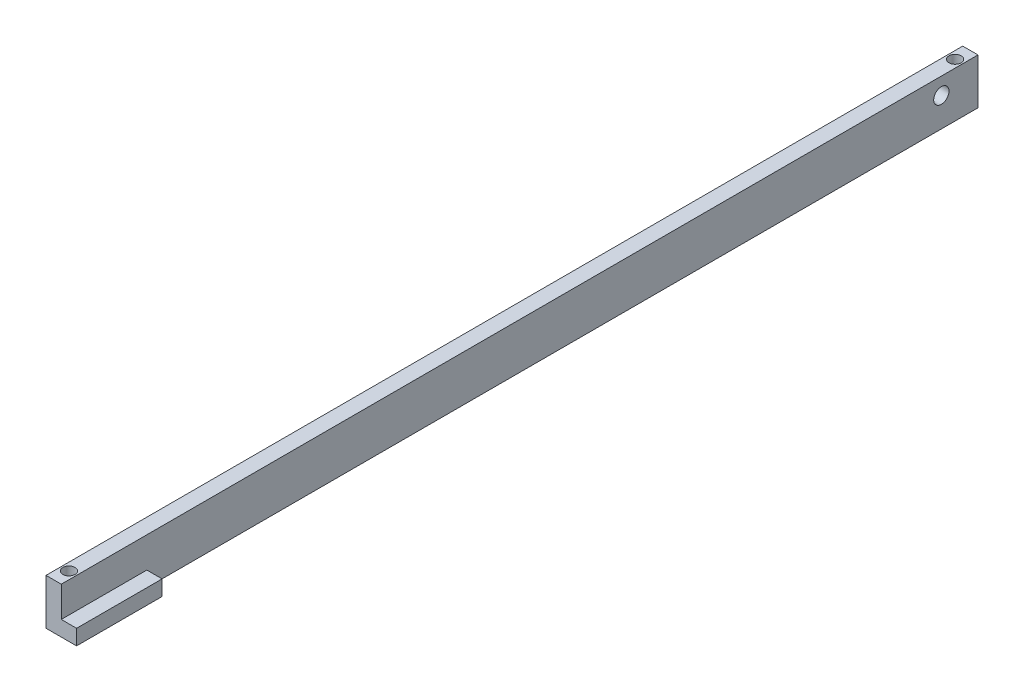
ISO-10303-21;
HEADER;
FILE_DESCRIPTION(('STEP AP214'),'2;1');
FILE_NAME('part.step','',(''),(''),'','','');
FILE_SCHEMA(('AUTOMOTIVE_DESIGN { 1 0 10303 214 1 1 1 1 }'));
ENDSEC;
DATA;
#1=APPLICATION_CONTEXT('core data for automotive mechanical design processes');
#2=APPLICATION_PROTOCOL_DEFINITION('international standard','automotive_design',2000,#1);
#3=PRODUCT_CONTEXT('',#1,'mechanical');
#4=PRODUCT('Part','Part','',(#3));
#5=PRODUCT_RELATED_PRODUCT_CATEGORY('part','',(#4));
#6=PRODUCT_DEFINITION_FORMATION('','',#4);
#7=PRODUCT_DEFINITION_CONTEXT('part definition',#1,'design');
#8=PRODUCT_DEFINITION('design','',#6,#7);
#9=PRODUCT_DEFINITION_SHAPE('','',#8);
#10=(LENGTH_UNIT() NAMED_UNIT(*) SI_UNIT(.MILLI.,.METRE.));
#11=(NAMED_UNIT(*) PLANE_ANGLE_UNIT() SI_UNIT($,.RADIAN.));
#12=(NAMED_UNIT(*) SI_UNIT($,.STERADIAN.) SOLID_ANGLE_UNIT());
#13=UNCERTAINTY_MEASURE_WITH_UNIT(LENGTH_MEASURE(1.E-05),#10,'distance_accuracy_value','');
#14=(GEOMETRIC_REPRESENTATION_CONTEXT(3) GLOBAL_UNCERTAINTY_ASSIGNED_CONTEXT((#13)) GLOBAL_UNIT_ASSIGNED_CONTEXT((#10,
#11,#12)) REPRESENTATION_CONTEXT('',''));
#15=CARTESIAN_POINT('',(0.,0.,0.));
#16=DIRECTION('',(0.,0.,1.));
#17=DIRECTION('',(1.,0.,0.));
#18=AXIS2_PLACEMENT_3D('',#15,#16,#17);
#19=CARTESIAN_POINT('',(0.,6.35,-381.));
#20=DIRECTION('',(1.,0.,0.));
#21=DIRECTION('',(0.,0.,-1.));
#22=AXIS2_PLACEMENT_3D('',#19,#20,#21);
#23=PLANE('',#22);
#24=DIRECTION('',(0.,-1.,0.));
#25=VECTOR('',#24,1.);
#26=CARTESIAN_POINT('',(0.,6.35,-35.56));
#27=LINE('',#26,#25);
#28=CARTESIAN_POINT('',(0.,6.35,-35.56));
#29=VERTEX_POINT('',#28);
#30=CARTESIAN_POINT('',(0.,0.,-35.56));
#31=VERTEX_POINT('',#30);
#32=EDGE_CURVE('E128',#29,#31,#27,.T.);
#33=ORIENTED_EDGE('',*,*,#32,.F.);
#34=DIRECTION('',(0.,0.,1.));
#35=VECTOR('',#34,1.);
#36=CARTESIAN_POINT('',(0.,6.35,-381.));
#37=LINE('',#36,#35);
#38=CARTESIAN_POINT('',(0.,6.35,0.));
#39=VERTEX_POINT('',#38);
#40=EDGE_CURVE('E45',#29,#39,#37,.T.);
#41=ORIENTED_EDGE('',*,*,#40,.T.);
#42=DIRECTION('',(0.,1.,0.));
#43=VECTOR('',#42,1.);
#44=CARTESIAN_POINT('',(0.,6.35,0.));
#45=LINE('',#44,#43);
#46=CARTESIAN_POINT('',(0.,0.,0.));
#47=VERTEX_POINT('',#46);
#48=EDGE_CURVE('E162',#47,#39,#45,.T.);
#49=ORIENTED_EDGE('',*,*,#48,.F.);
#50=DIRECTION('',(0.,0.,1.));
#51=VECTOR('',#50,1.);
#52=CARTESIAN_POINT('',(0.,0.,-381.));
#53=LINE('',#52,#51);
#54=EDGE_CURVE('E11',#31,#47,#53,.T.);
#55=ORIENTED_EDGE('',*,*,#54,.F.);
#56=EDGE_LOOP('',(#33,#41,#49,#55));
#57=FACE_BOUND('',#56,.T.);
#58=ADVANCED_FACE('F42',(#57),#23,.T.);
#59=CARTESIAN_POINT('',(0.,0.,-381.));
#60=DIRECTION('',(0.,-1.,0.));
#61=DIRECTION('',(1.,0.,0.));
#62=AXIS2_PLACEMENT_3D('',#59,#60,#61);
#63=PLANE('',#62);
#64=DIRECTION('',(0.,0.,-1.));
#65=VECTOR('',#64,1.);
#66=CARTESIAN_POINT('',(-6.35,0.,-35.56));
#67=LINE('',#66,#65);
#68=CARTESIAN_POINT('',(-6.35,0.,-35.56));
#69=VERTEX_POINT('',#68);
#70=CARTESIAN_POINT('',(-6.35,0.,-381.));
#71=VERTEX_POINT('',#70);
#72=EDGE_CURVE('E206',#69,#71,#67,.T.);
#73=ORIENTED_EDGE('',*,*,#72,.F.);
#74=DIRECTION('',(-1.,0.,0.));
#75=VECTOR('',#74,1.);
#76=CARTESIAN_POINT('',(-6.35,0.,-35.56));
#77=LINE('',#76,#75);
#78=EDGE_CURVE('E115',#31,#69,#77,.T.);
#79=ORIENTED_EDGE('',*,*,#78,.F.);
#80=ORIENTED_EDGE('',*,*,#54,.T.);
#81=DIRECTION('',(1.,0.,0.));
#82=VECTOR('',#81,1.);
#83=CARTESIAN_POINT('',(0.,0.,0.));
#84=LINE('',#83,#82);
#85=CARTESIAN_POINT('',(-12.7,0.,0.));
#86=VERTEX_POINT('',#85);
#87=EDGE_CURVE('E145',#86,#47,#84,.T.);
#88=ORIENTED_EDGE('',*,*,#87,.F.);
#89=DIRECTION('',(0.,0.,1.));
#90=VECTOR('',#89,1.);
#91=CARTESIAN_POINT('',(-12.7,0.,-381.));
#92=LINE('',#91,#90);
#93=CARTESIAN_POINT('',(-12.7,0.,-381.));
#94=VERTEX_POINT('',#93);
#95=EDGE_CURVE('E51',#94,#86,#92,.T.);
#96=ORIENTED_EDGE('',*,*,#95,.F.);
#97=DIRECTION('',(1.,0.,0.));
#98=VECTOR('',#97,1.);
#99=CARTESIAN_POINT('',(0.,0.,-381.));
#100=LINE('',#99,#98);
#101=EDGE_CURVE('E139',#94,#71,#100,.T.);
#102=ORIENTED_EDGE('',*,*,#101,.T.);
#103=EDGE_LOOP('',(#73,#79,#80,#88,#96,#102));
#104=FACE_BOUND('',#103,.T.);
#105=CARTESIAN_POINT('',(-9.52499999999996,0.,-374.65));
#106=DIRECTION('',(0.,-1.,0.));
#107=DIRECTION('',(1.,0.,0.));
#108=AXIS2_PLACEMENT_3D('',#105,#106,#107);
#109=CIRCLE('',#108,2.54000000000001);
#110=CARTESIAN_POINT('',(-6.98499999999995,0.,-374.65));
#111=VERTEX_POINT('',#110);
#112=EDGE_CURVE('E210',#111,#111,#109,.T.);
#113=ORIENTED_EDGE('',*,*,#112,.F.);
#114=EDGE_LOOP('',(#113));
#115=FACE_BOUND('',#114,.T.);
#116=CARTESIAN_POINT('',(-9.525,0.,-6.35));
#117=DIRECTION('',(0.,-1.,0.));
#118=DIRECTION('',(1.,0.,0.));
#119=AXIS2_PLACEMENT_3D('',#116,#117,#118);
#120=CIRCLE('',#119,2.54);
#121=CARTESIAN_POINT('',(-6.985,0.,-6.35));
#122=VERTEX_POINT('',#121);
#123=EDGE_CURVE('E205',#122,#122,#120,.T.);
#124=ORIENTED_EDGE('',*,*,#123,.F.);
#125=EDGE_LOOP('',(#124));
#126=FACE_BOUND('',#125,.T.);
#127=ADVANCED_FACE('F223',(#104,#115,#126),#63,.T.);
#128=CARTESIAN_POINT('',(-12.7,0.,-381.));
#129=DIRECTION('',(-1.,0.,0.));
#130=DIRECTION('',(0.,-1.,0.));
#131=AXIS2_PLACEMENT_3D('',#128,#129,#130);
#132=PLANE('',#131);
#133=CARTESIAN_POINT('',(-12.7,12.065,-365.76));
#134=DIRECTION('',(-1.,0.,0.));
#135=DIRECTION('',(0.,-1.,0.));
#136=AXIS2_PLACEMENT_3D('',#133,#134,#135);
#137=CIRCLE('',#136,3.17500000000003);
#138=CARTESIAN_POINT('',(-12.7,8.88999999999997,-365.76));
#139=VERTEX_POINT('',#138);
#140=EDGE_CURVE('E166',#139,#139,#137,.T.);
#141=ORIENTED_EDGE('',*,*,#140,.F.);
#142=EDGE_LOOP('',(#141));
#143=FACE_BOUND('',#142,.T.);
#144=DIRECTION('',(0.,-1.,0.));
#145=VECTOR('',#144,1.);
#146=CARTESIAN_POINT('',(-12.7,0.,0.));
#147=LINE('',#146,#145);
#148=CARTESIAN_POINT('',(-12.7,19.05,0.));
#149=VERTEX_POINT('',#148);
#150=EDGE_CURVE('E149',#149,#86,#147,.T.);
#151=ORIENTED_EDGE('',*,*,#150,.F.);
#152=DIRECTION('',(0.,0.,1.));
#153=VECTOR('',#152,1.);
#154=CARTESIAN_POINT('',(-12.7,19.05,-381.));
#155=LINE('',#154,#153);
#156=CARTESIAN_POINT('',(-12.7,19.05,-381.));
#157=VERTEX_POINT('',#156);
#158=EDGE_CURVE('E137',#157,#149,#155,.T.);
#159=ORIENTED_EDGE('',*,*,#158,.F.);
#160=DIRECTION('',(0.,-1.,0.));
#161=VECTOR('',#160,1.);
#162=CARTESIAN_POINT('',(-12.7,0.,-381.));
#163=LINE('',#162,#161);
#164=EDGE_CURVE('E169',#157,#94,#163,.T.);
#165=ORIENTED_EDGE('',*,*,#164,.T.);
#166=ORIENTED_EDGE('',*,*,#95,.T.);
#167=EDGE_LOOP('',(#151,#159,#165,#166));
#168=FACE_BOUND('',#167,.T.);
#169=ADVANCED_FACE('F229',(#143,#168),#132,.T.);
#170=CARTESIAN_POINT('',(-12.7,19.05,-381.));
#171=DIRECTION('',(0.,1.,0.));
#172=DIRECTION('',(0.,0.,1.));
#173=AXIS2_PLACEMENT_3D('',#170,#171,#172);
#174=PLANE('',#173);
#175=CARTESIAN_POINT('',(-9.525,19.05,-6.35));
#176=DIRECTION('',(0.,1.,0.));
#177=DIRECTION('',(0.,0.,1.));
#178=AXIS2_PLACEMENT_3D('',#175,#176,#177);
#179=CIRCLE('',#178,2.54);
#180=CARTESIAN_POINT('',(-9.525,19.05,-3.81));
#181=VERTEX_POINT('',#180);
#182=EDGE_CURVE('E194',#181,#181,#179,.T.);
#183=ORIENTED_EDGE('',*,*,#182,.F.);
#184=EDGE_LOOP('',(#183));
#185=FACE_BOUND('',#184,.T.);
#186=CARTESIAN_POINT('',(-9.525,19.05,-374.65));
#187=DIRECTION('',(0.,1.,0.));
#188=DIRECTION('',(0.,0.,1.));
#189=AXIS2_PLACEMENT_3D('',#186,#187,#188);
#190=CIRCLE('',#189,2.54);
#191=CARTESIAN_POINT('',(-9.525,19.05,-372.11));
#192=VERTEX_POINT('',#191);
#193=EDGE_CURVE('E189',#192,#192,#190,.T.);
#194=ORIENTED_EDGE('',*,*,#193,.F.);
#195=EDGE_LOOP('',(#194));
#196=FACE_BOUND('',#195,.T.);
#197=DIRECTION('',(-1.,0.,0.));
#198=VECTOR('',#197,1.);
#199=CARTESIAN_POINT('',(-12.7,19.05,0.));
#200=LINE('',#199,#198);
#201=CARTESIAN_POINT('',(-6.35,19.05,0.));
#202=VERTEX_POINT('',#201);
#203=EDGE_CURVE('E153',#202,#149,#200,.T.);
#204=ORIENTED_EDGE('',*,*,#203,.F.);
#205=DIRECTION('',(0.,0.,1.));
#206=VECTOR('',#205,1.);
#207=CARTESIAN_POINT('',(-6.35,19.05,-381.));
#208=LINE('',#207,#206);
#209=CARTESIAN_POINT('',(-6.35,19.05,-381.));
#210=VERTEX_POINT('',#209);
#211=EDGE_CURVE('E96',#210,#202,#208,.T.);
#212=ORIENTED_EDGE('',*,*,#211,.F.);
#213=DIRECTION('',(-1.,0.,0.));
#214=VECTOR('',#213,1.);
#215=CARTESIAN_POINT('',(-12.7,19.05,-381.));
#216=LINE('',#215,#214);
#217=EDGE_CURVE('E172',#210,#157,#216,.T.);
#218=ORIENTED_EDGE('',*,*,#217,.T.);
#219=ORIENTED_EDGE('',*,*,#158,.T.);
#220=EDGE_LOOP('',(#204,#212,#218,#219));
#221=FACE_BOUND('',#220,.T.);
#222=ADVANCED_FACE('F249',(#185,#196,#221),#174,.T.);
#223=CARTESIAN_POINT('',(-6.35,19.05,-381.));
#224=DIRECTION('',(1.,0.,0.));
#225=DIRECTION('',(0.,1.,0.));
#226=AXIS2_PLACEMENT_3D('',#223,#224,#225);
#227=PLANE('',#226);
#228=CARTESIAN_POINT('',(-6.35,12.065,-365.76));
#229=DIRECTION('',(1.,0.,0.));
#230=DIRECTION('',(0.,1.,0.));
#231=AXIS2_PLACEMENT_3D('',#228,#229,#230);
#232=CIRCLE('',#231,3.17500000000003);
#233=CARTESIAN_POINT('',(-6.35,15.24,-365.76));
#234=VERTEX_POINT('',#233);
#235=EDGE_CURVE('E177',#234,#234,#232,.F.);
#236=ORIENTED_EDGE('',*,*,#235,.T.);
#237=EDGE_LOOP('',(#236));
#238=FACE_BOUND('',#237,.T.);
#239=DIRECTION('',(0.,1.,0.));
#240=VECTOR('',#239,1.);
#241=CARTESIAN_POINT('',(-6.35,19.05,0.));
#242=LINE('',#241,#240);
#243=CARTESIAN_POINT('',(-6.35,6.35,0.));
#244=VERTEX_POINT('',#243);
#245=EDGE_CURVE('E132',#244,#202,#242,.T.);
#246=ORIENTED_EDGE('',*,*,#245,.F.);
#247=DIRECTION('',(0.,0.,1.));
#248=VECTOR('',#247,1.);
#249=CARTESIAN_POINT('',(-6.35,6.35,-381.));
#250=LINE('',#249,#248);
#251=CARTESIAN_POINT('',(-6.35,6.35,-35.56));
#252=VERTEX_POINT('',#251);
#253=EDGE_CURVE('E125',#252,#244,#250,.T.);
#254=ORIENTED_EDGE('',*,*,#253,.F.);
#255=DIRECTION('',(0.,1.,0.));
#256=VECTOR('',#255,1.);
#257=CARTESIAN_POINT('',(-6.35,6.35,-35.56));
#258=LINE('',#257,#256);
#259=EDGE_CURVE('E110',#69,#252,#258,.T.);
#260=ORIENTED_EDGE('',*,*,#259,.F.);
#261=ORIENTED_EDGE('',*,*,#72,.T.);
#262=DIRECTION('',(0.,1.,0.));
#263=VECTOR('',#262,1.);
#264=CARTESIAN_POINT('',(-6.35,19.05,-381.));
#265=LINE('',#264,#263);
#266=EDGE_CURVE('E59',#71,#210,#265,.T.);
#267=ORIENTED_EDGE('',*,*,#266,.T.);
#268=ORIENTED_EDGE('',*,*,#211,.T.);
#269=EDGE_LOOP('',(#246,#254,#260,#261,#267,#268));
#270=FACE_BOUND('',#269,.T.);
#271=ADVANCED_FACE('F130',(#238,#270),#227,.T.);
#272=CARTESIAN_POINT('',(-6.35,6.35,-381.));
#273=DIRECTION('',(0.,1.,0.));
#274=DIRECTION('',(0.,0.,1.));
#275=AXIS2_PLACEMENT_3D('',#272,#273,#274);
#276=PLANE('',#275);
#277=DIRECTION('',(1.,0.,0.));
#278=VECTOR('',#277,1.);
#279=CARTESIAN_POINT('',(-6.35,6.35,-35.56));
#280=LINE('',#279,#278);
#281=EDGE_CURVE('E113',#252,#29,#280,.T.);
#282=ORIENTED_EDGE('',*,*,#281,.F.);
#283=ORIENTED_EDGE('',*,*,#253,.T.);
#284=DIRECTION('',(-1.,0.,0.));
#285=VECTOR('',#284,1.);
#286=CARTESIAN_POINT('',(-6.35,6.35,0.));
#287=LINE('',#286,#285);
#288=EDGE_CURVE('E159',#39,#244,#287,.T.);
#289=ORIENTED_EDGE('',*,*,#288,.F.);
#290=ORIENTED_EDGE('',*,*,#40,.F.);
#291=EDGE_LOOP('',(#282,#283,#289,#290));
#292=FACE_BOUND('',#291,.T.);
#293=ADVANCED_FACE('F123',(#292),#276,.T.);
#294=CARTESIAN_POINT('',(0.,0.,-381.));
#295=DIRECTION('',(0.,0.,-1.));
#296=DIRECTION('',(-1.,0.,0.));
#297=AXIS2_PLACEMENT_3D('',#294,#295,#296);
#298=PLANE('',#297);
#299=ORIENTED_EDGE('',*,*,#266,.F.);
#300=ORIENTED_EDGE('',*,*,#101,.F.);
#301=ORIENTED_EDGE('',*,*,#164,.F.);
#302=ORIENTED_EDGE('',*,*,#217,.F.);
#303=EDGE_LOOP('',(#299,#300,#301,#302));
#304=FACE_BOUND('',#303,.T.);
#305=ADVANCED_FACE('F231',(#304),#298,.T.);
#306=CARTESIAN_POINT('',(0.,0.,0.));
#307=DIRECTION('',(0.,0.,-1.));
#308=DIRECTION('',(-1.,0.,0.));
#309=AXIS2_PLACEMENT_3D('',#306,#307,#308);
#310=PLANE('',#309);
#311=ORIENTED_EDGE('',*,*,#48,.T.);
#312=ORIENTED_EDGE('',*,*,#288,.T.);
#313=ORIENTED_EDGE('',*,*,#245,.T.);
#314=ORIENTED_EDGE('',*,*,#203,.T.);
#315=ORIENTED_EDGE('',*,*,#150,.T.);
#316=ORIENTED_EDGE('',*,*,#87,.T.);
#317=EDGE_LOOP('',(#311,#312,#313,#314,#315,#316));
#318=FACE_BOUND('',#317,.T.);
#319=ADVANCED_FACE('F226',(#318),#310,.F.);
#320=CARTESIAN_POINT('',(0.000999999999999265,12.065,-365.76));
#321=DIRECTION('',(-1.,0.,0.));
#322=DIRECTION('',(0.,-1.,0.));
#323=AXIS2_PLACEMENT_3D('',#320,#321,#322);
#324=CYLINDRICAL_SURFACE('',#323,3.17500000000003);
#325=ORIENTED_EDGE('',*,*,#235,.F.);
#326=EDGE_LOOP('',(#325));
#327=FACE_BOUND('',#326,.T.);
#328=ORIENTED_EDGE('',*,*,#140,.T.);
#329=EDGE_LOOP('',(#328));
#330=FACE_BOUND('',#329,.T.);
#331=ADVANCED_FACE('F238',(#327,#330),#324,.F.);
#332=CARTESIAN_POINT('',(-9.525,11.43,-374.65));
#333=DIRECTION('',(0.,1.,0.));
#334=DIRECTION('',(0.,0.,1.));
#335=AXIS2_PLACEMENT_3D('',#332,#333,#334);
#336=CYLINDRICAL_SURFACE('',#335,2.54);
#337=CARTESIAN_POINT('',(-9.525,11.43,-374.65));
#338=DIRECTION('',(0.,1.,0.));
#339=DIRECTION('',(0.,0.,1.));
#340=AXIS2_PLACEMENT_3D('',#337,#338,#339);
#341=CIRCLE('',#340,2.54);
#342=CARTESIAN_POINT('',(-9.525,11.43,-372.11));
#343=VERTEX_POINT('',#342);
#344=EDGE_CURVE('E185',#343,#343,#341,.T.);
#345=CARTESIAN_POINT('',(-9.525,11.43,-372.11));
#346=CARTESIAN_POINT('',(-9.525,11.509375,-372.11));
#347=CARTESIAN_POINT('',(-9.525,11.58875,-372.11));
#348=CARTESIAN_POINT('',(-9.525,11.7475,-372.11));
#349=CARTESIAN_POINT('',(-9.525,11.826875,-372.11));
#350=CARTESIAN_POINT('',(-9.525,11.985625,-372.11));
#351=CARTESIAN_POINT('',(-9.525,12.065,-372.11));
#352=CARTESIAN_POINT('',(-9.525,12.22375,-372.11));
#353=CARTESIAN_POINT('',(-9.525,12.303125,-372.11));
#354=CARTESIAN_POINT('',(-9.525,12.461875,-372.11));
#355=CARTESIAN_POINT('',(-9.525,12.54125,-372.11));
#356=CARTESIAN_POINT('',(-9.525,12.7,-372.11));
#357=CARTESIAN_POINT('',(-9.525,12.779375,-372.11));
#358=CARTESIAN_POINT('',(-9.525,12.938125,-372.11));
#359=CARTESIAN_POINT('',(-9.525,13.0175,-372.11));
#360=CARTESIAN_POINT('',(-9.525,13.17625,-372.11));
#361=CARTESIAN_POINT('',(-9.525,13.255625,-372.11));
#362=CARTESIAN_POINT('',(-9.525,13.414375,-372.11));
#363=CARTESIAN_POINT('',(-9.525,13.49375,-372.11));
#364=CARTESIAN_POINT('',(-9.525,13.6525,-372.11));
#365=CARTESIAN_POINT('',(-9.525,13.731875,-372.11));
#366=CARTESIAN_POINT('',(-9.525,13.890625,-372.11));
#367=CARTESIAN_POINT('',(-9.525,13.97,-372.11));
#368=CARTESIAN_POINT('',(-9.525,14.12875,-372.11));
#369=CARTESIAN_POINT('',(-9.525,14.208125,-372.11));
#370=CARTESIAN_POINT('',(-9.525,14.366875,-372.11));
#371=CARTESIAN_POINT('',(-9.525,14.44625,-372.11));
#372=CARTESIAN_POINT('',(-9.525,14.605,-372.11));
#373=CARTESIAN_POINT('',(-9.525,14.684375,-372.11));
#374=CARTESIAN_POINT('',(-9.525,14.843125,-372.11));
#375=CARTESIAN_POINT('',(-9.525,14.9225,-372.11));
#376=CARTESIAN_POINT('',(-9.525,15.08125,-372.11));
#377=CARTESIAN_POINT('',(-9.525,15.160625,-372.11));
#378=CARTESIAN_POINT('',(-9.525,15.319375,-372.11));
#379=CARTESIAN_POINT('',(-9.525,15.39875,-372.11));
#380=CARTESIAN_POINT('',(-9.525,15.5575,-372.11));
#381=CARTESIAN_POINT('',(-9.525,15.636875,-372.11));
#382=CARTESIAN_POINT('',(-9.525,15.795625,-372.11));
#383=CARTESIAN_POINT('',(-9.525,15.875,-372.11));
#384=CARTESIAN_POINT('',(-9.525,16.03375,-372.11));
#385=CARTESIAN_POINT('',(-9.525,16.113125,-372.11));
#386=CARTESIAN_POINT('',(-9.525,16.271875,-372.11));
#387=CARTESIAN_POINT('',(-9.525,16.35125,-372.11));
#388=CARTESIAN_POINT('',(-9.525,16.51,-372.11));
#389=CARTESIAN_POINT('',(-9.525,16.589375,-372.11));
#390=CARTESIAN_POINT('',(-9.525,16.748125,-372.11));
#391=CARTESIAN_POINT('',(-9.525,16.8275,-372.11));
#392=CARTESIAN_POINT('',(-9.525,16.98625,-372.11));
#393=CARTESIAN_POINT('',(-9.525,17.065625,-372.11));
#394=CARTESIAN_POINT('',(-9.525,17.224375,-372.11));
#395=CARTESIAN_POINT('',(-9.525,17.30375,-372.11));
#396=CARTESIAN_POINT('',(-9.525,17.4625,-372.11));
#397=CARTESIAN_POINT('',(-9.525,17.541875,-372.11));
#398=CARTESIAN_POINT('',(-9.525,17.700625,-372.11));
#399=CARTESIAN_POINT('',(-9.525,17.78,-372.11));
#400=CARTESIAN_POINT('',(-9.525,17.93875,-372.11));
#401=CARTESIAN_POINT('',(-9.525,18.018125,-372.11));
#402=CARTESIAN_POINT('',(-9.525,18.176875,-372.11));
#403=CARTESIAN_POINT('',(-9.525,18.25625,-372.11));
#404=CARTESIAN_POINT('',(-9.525,18.415,-372.11));
#405=CARTESIAN_POINT('',(-9.525,18.494375,-372.11));
#406=CARTESIAN_POINT('',(-9.525,18.653125,-372.11));
#407=CARTESIAN_POINT('',(-9.525,18.7325,-372.11));
#408=CARTESIAN_POINT('',(-9.525,18.89125,-372.11));
#409=CARTESIAN_POINT('',(-9.525,18.970625,-372.11));
#410=CARTESIAN_POINT('',(-9.525,19.05,-372.11));
#411=B_SPLINE_CURVE_WITH_KNOTS('',3,(#345,#346,#347,#348,#349,#350,#351,#352,#353,#354,#355,
#356,#357,#358,#359,#360,#361,#362,#363,#364,#365,#366,#367,#368,#369,#370,#371,#372,#373,#374,
#375,#376,#377,#378,#379,#380,#381,#382,#383,#384,#385,#386,#387,#388,#389,#390,#391,#392,#393,
#394,#395,#396,#397,#398,#399,#400,#401,#402,#403,#404,#405,#406,#407,#408,#409,#410),
.UNSPECIFIED.,.F.,.F.,(4,2,2,2,2,2,2,2,2,2,2,2,2,2,2,2,2,2,2,2,2,2,2,2,2,2,2,2,2,2,2,2,4),(0.,
0.238125,0.476250000000001,0.714375,0.9525,1.190625,1.42875,1.666875,1.905,2.143125,2.38125,
2.619375,2.8575,3.095625,3.33375,3.571875,3.81,4.048125,4.28625,4.524375,4.7625,5.000625,
5.23875,5.476875,5.715,5.953125,6.19125,6.429375,6.6675,6.905625,7.14375,7.381875,7.62),.UNSPECIFIED.);
#412=EDGE_CURVE('BSEAM264',#343,#192,#411,.T.);
#413=ORIENTED_EDGE('',*,*,#344,.F.);
#414=ORIENTED_EDGE('',*,*,#193,.T.);
#415=ORIENTED_EDGE('',*,*,#412,.T.);
#416=ORIENTED_EDGE('',*,*,#412,.F.);
#417=EDGE_LOOP('',(#413,#415,#414,#416));
#418=FACE_BOUND('',#417,.T.);
#419=ADVANCED_FACE('F264',(#418),#336,.F.);
#420=CARTESIAN_POINT('',(-9.525,11.43,-374.65));
#421=DIRECTION('',(0.,1.,0.));
#422=DIRECTION('',(0.,0.,1.));
#423=AXIS2_PLACEMENT_3D('',#420,#421,#422);
#424=PLANE('',#423);
#425=ORIENTED_EDGE('',*,*,#344,.T.);
#426=EDGE_LOOP('',(#425));
#427=FACE_BOUND('',#426,.T.);
#428=ADVANCED_FACE('F269',(#427),#424,.T.);
#429=CARTESIAN_POINT('',(-9.525,11.43,-6.35));
#430=DIRECTION('',(0.,1.,0.));
#431=DIRECTION('',(0.,0.,1.));
#432=AXIS2_PLACEMENT_3D('',#429,#430,#431);
#433=CYLINDRICAL_SURFACE('',#432,2.54);
#434=CARTESIAN_POINT('',(-9.525,11.43,-6.35));
#435=DIRECTION('',(0.,1.,0.));
#436=DIRECTION('',(0.,0.,1.));
#437=AXIS2_PLACEMENT_3D('',#434,#435,#436);
#438=CIRCLE('',#437,2.54);
#439=CARTESIAN_POINT('',(-9.525,11.43,-3.81));
#440=VERTEX_POINT('',#439);
#441=EDGE_CURVE('E181',#440,#440,#438,.T.);
#442=CARTESIAN_POINT('',(-9.525,11.43,-3.81));
#443=CARTESIAN_POINT('',(-9.525,11.509375,-3.81));
#444=CARTESIAN_POINT('',(-9.525,11.58875,-3.81));
#445=CARTESIAN_POINT('',(-9.525,11.7475,-3.81));
#446=CARTESIAN_POINT('',(-9.525,11.826875,-3.81));
#447=CARTESIAN_POINT('',(-9.525,11.985625,-3.81));
#448=CARTESIAN_POINT('',(-9.525,12.065,-3.81));
#449=CARTESIAN_POINT('',(-9.525,12.22375,-3.81));
#450=CARTESIAN_POINT('',(-9.525,12.303125,-3.81));
#451=CARTESIAN_POINT('',(-9.525,12.461875,-3.81));
#452=CARTESIAN_POINT('',(-9.525,12.54125,-3.81));
#453=CARTESIAN_POINT('',(-9.525,12.7,-3.81));
#454=CARTESIAN_POINT('',(-9.525,12.779375,-3.81));
#455=CARTESIAN_POINT('',(-9.525,12.938125,-3.81));
#456=CARTESIAN_POINT('',(-9.525,13.0175,-3.81));
#457=CARTESIAN_POINT('',(-9.525,13.17625,-3.81));
#458=CARTESIAN_POINT('',(-9.525,13.255625,-3.81));
#459=CARTESIAN_POINT('',(-9.525,13.414375,-3.81));
#460=CARTESIAN_POINT('',(-9.525,13.49375,-3.81));
#461=CARTESIAN_POINT('',(-9.525,13.6525,-3.81));
#462=CARTESIAN_POINT('',(-9.525,13.731875,-3.81));
#463=CARTESIAN_POINT('',(-9.525,13.890625,-3.81));
#464=CARTESIAN_POINT('',(-9.525,13.97,-3.81));
#465=CARTESIAN_POINT('',(-9.525,14.12875,-3.81));
#466=CARTESIAN_POINT('',(-9.525,14.208125,-3.81));
#467=CARTESIAN_POINT('',(-9.525,14.366875,-3.81));
#468=CARTESIAN_POINT('',(-9.525,14.44625,-3.81));
#469=CARTESIAN_POINT('',(-9.525,14.605,-3.81));
#470=CARTESIAN_POINT('',(-9.525,14.684375,-3.81));
#471=CARTESIAN_POINT('',(-9.525,14.843125,-3.81));
#472=CARTESIAN_POINT('',(-9.525,14.9225,-3.81));
#473=CARTESIAN_POINT('',(-9.525,15.08125,-3.81));
#474=CARTESIAN_POINT('',(-9.525,15.160625,-3.81));
#475=CARTESIAN_POINT('',(-9.525,15.319375,-3.81));
#476=CARTESIAN_POINT('',(-9.525,15.39875,-3.81));
#477=CARTESIAN_POINT('',(-9.525,15.5575,-3.81));
#478=CARTESIAN_POINT('',(-9.525,15.636875,-3.81));
#479=CARTESIAN_POINT('',(-9.525,15.795625,-3.81));
#480=CARTESIAN_POINT('',(-9.525,15.875,-3.81));
#481=CARTESIAN_POINT('',(-9.525,16.03375,-3.81));
#482=CARTESIAN_POINT('',(-9.525,16.113125,-3.81));
#483=CARTESIAN_POINT('',(-9.525,16.271875,-3.81));
#484=CARTESIAN_POINT('',(-9.525,16.35125,-3.81));
#485=CARTESIAN_POINT('',(-9.525,16.51,-3.81));
#486=CARTESIAN_POINT('',(-9.525,16.589375,-3.81));
#487=CARTESIAN_POINT('',(-9.525,16.748125,-3.81));
#488=CARTESIAN_POINT('',(-9.525,16.8275,-3.81));
#489=CARTESIAN_POINT('',(-9.525,16.98625,-3.81));
#490=CARTESIAN_POINT('',(-9.525,17.065625,-3.81));
#491=CARTESIAN_POINT('',(-9.525,17.224375,-3.81));
#492=CARTESIAN_POINT('',(-9.525,17.30375,-3.81));
#493=CARTESIAN_POINT('',(-9.525,17.4625,-3.81));
#494=CARTESIAN_POINT('',(-9.525,17.541875,-3.81));
#495=CARTESIAN_POINT('',(-9.525,17.700625,-3.81));
#496=CARTESIAN_POINT('',(-9.525,17.78,-3.81));
#497=CARTESIAN_POINT('',(-9.525,17.93875,-3.81));
#498=CARTESIAN_POINT('',(-9.525,18.018125,-3.81));
#499=CARTESIAN_POINT('',(-9.525,18.176875,-3.81));
#500=CARTESIAN_POINT('',(-9.525,18.25625,-3.81));
#501=CARTESIAN_POINT('',(-9.525,18.415,-3.81));
#502=CARTESIAN_POINT('',(-9.525,18.494375,-3.81));
#503=CARTESIAN_POINT('',(-9.525,18.653125,-3.81));
#504=CARTESIAN_POINT('',(-9.525,18.7325,-3.81));
#505=CARTESIAN_POINT('',(-9.525,18.89125,-3.81));
#506=CARTESIAN_POINT('',(-9.525,18.970625,-3.81));
#507=CARTESIAN_POINT('',(-9.525,19.05,-3.81));
#508=B_SPLINE_CURVE_WITH_KNOTS('',3,(#442,#443,#444,#445,#446,#447,#448,#449,#450,#451,#452,
#453,#454,#455,#456,#457,#458,#459,#460,#461,#462,#463,#464,#465,#466,#467,#468,#469,#470,#471,
#472,#473,#474,#475,#476,#477,#478,#479,#480,#481,#482,#483,#484,#485,#486,#487,#488,#489,#490,
#491,#492,#493,#494,#495,#496,#497,#498,#499,#500,#501,#502,#503,#504,#505,#506,#507),
.UNSPECIFIED.,.F.,.F.,(4,2,2,2,2,2,2,2,2,2,2,2,2,2,2,2,2,2,2,2,2,2,2,2,2,2,2,2,2,2,2,2,4),(0.,
0.238125,0.476250000000001,0.714375,0.9525,1.190625,1.42875,1.666875,1.905,2.143125,2.38125,
2.619375,2.8575,3.095625,3.33375,3.571875,3.81,4.048125,4.28625,4.524375,4.7625,5.000625,
5.23875,5.476875,5.715,5.953125,6.19125,6.429375,6.6675,6.905625,7.14375,7.381875,7.62),.UNSPECIFIED.);
#509=EDGE_CURVE('BSEAM274',#440,#181,#508,.T.);
#510=ORIENTED_EDGE('',*,*,#441,.F.);
#511=ORIENTED_EDGE('',*,*,#182,.T.);
#512=ORIENTED_EDGE('',*,*,#509,.T.);
#513=ORIENTED_EDGE('',*,*,#509,.F.);
#514=EDGE_LOOP('',(#510,#512,#511,#513));
#515=FACE_BOUND('',#514,.T.);
#516=ADVANCED_FACE('F274',(#515),#433,.F.);
#517=CARTESIAN_POINT('',(-9.525,11.43,-6.35));
#518=DIRECTION('',(0.,1.,0.));
#519=DIRECTION('',(0.,0.,1.));
#520=AXIS2_PLACEMENT_3D('',#517,#518,#519);
#521=PLANE('',#520);
#522=ORIENTED_EDGE('',*,*,#441,.T.);
#523=EDGE_LOOP('',(#522));
#524=FACE_BOUND('',#523,.T.);
#525=ADVANCED_FACE('F279',(#524),#521,.T.);
#526=CARTESIAN_POINT('',(-9.525,7.62,-6.35));
#527=DIRECTION('',(0.,-1.,0.));
#528=DIRECTION('',(1.,0.,0.));
#529=AXIS2_PLACEMENT_3D('',#526,#527,#528);
#530=CYLINDRICAL_SURFACE('',#529,2.54);
#531=CARTESIAN_POINT('',(-9.525,7.62,-6.35));
#532=DIRECTION('',(0.,-1.,0.));
#533=DIRECTION('',(1.,0.,0.));
#534=AXIS2_PLACEMENT_3D('',#531,#532,#533);
#535=CIRCLE('',#534,2.54);
#536=CARTESIAN_POINT('',(-6.985,7.62,-6.35));
#537=VERTEX_POINT('',#536);
#538=EDGE_CURVE('E201',#537,#537,#535,.T.);
#539=CARTESIAN_POINT('',(-6.985,7.62,-6.35));
#540=CARTESIAN_POINT('',(-6.985,7.540625,-6.35));
#541=CARTESIAN_POINT('',(-6.985,7.46125,-6.35));
#542=CARTESIAN_POINT('',(-6.985,7.3025,-6.35));
#543=CARTESIAN_POINT('',(-6.985,7.223125,-6.35));
#544=CARTESIAN_POINT('',(-6.985,7.064375,-6.35));
#545=CARTESIAN_POINT('',(-6.985,6.985,-6.35));
#546=CARTESIAN_POINT('',(-6.985,6.82625,-6.35));
#547=CARTESIAN_POINT('',(-6.985,6.746875,-6.35));
#548=CARTESIAN_POINT('',(-6.985,6.588125,-6.35));
#549=CARTESIAN_POINT('',(-6.985,6.50875,-6.35));
#550=CARTESIAN_POINT('',(-6.985,6.35,-6.35));
#551=CARTESIAN_POINT('',(-6.985,6.270625,-6.35));
#552=CARTESIAN_POINT('',(-6.985,6.111875,-6.35));
#553=CARTESIAN_POINT('',(-6.985,6.0325,-6.35));
#554=CARTESIAN_POINT('',(-6.985,5.87375,-6.35));
#555=CARTESIAN_POINT('',(-6.985,5.794375,-6.35));
#556=CARTESIAN_POINT('',(-6.985,5.635625,-6.35));
#557=CARTESIAN_POINT('',(-6.985,5.55625,-6.35));
#558=CARTESIAN_POINT('',(-6.985,5.3975,-6.35));
#559=CARTESIAN_POINT('',(-6.985,5.318125,-6.35));
#560=CARTESIAN_POINT('',(-6.985,5.159375,-6.35));
#561=CARTESIAN_POINT('',(-6.985,5.08,-6.35));
#562=CARTESIAN_POINT('',(-6.985,4.92125,-6.35));
#563=CARTESIAN_POINT('',(-6.985,4.841875,-6.35));
#564=CARTESIAN_POINT('',(-6.985,4.683125,-6.35));
#565=CARTESIAN_POINT('',(-6.985,4.60375,-6.35));
#566=CARTESIAN_POINT('',(-6.985,4.445,-6.35));
#567=CARTESIAN_POINT('',(-6.985,4.365625,-6.35));
#568=CARTESIAN_POINT('',(-6.985,4.206875,-6.35));
#569=CARTESIAN_POINT('',(-6.985,4.1275,-6.35));
#570=CARTESIAN_POINT('',(-6.985,3.96875,-6.35));
#571=CARTESIAN_POINT('',(-6.985,3.889375,-6.35));
#572=CARTESIAN_POINT('',(-6.985,3.730625,-6.35));
#573=CARTESIAN_POINT('',(-6.985,3.65125,-6.35));
#574=CARTESIAN_POINT('',(-6.985,3.4925,-6.35));
#575=CARTESIAN_POINT('',(-6.985,3.413125,-6.35));
#576=CARTESIAN_POINT('',(-6.985,3.254375,-6.35));
#577=CARTESIAN_POINT('',(-6.985,3.175,-6.35));
#578=CARTESIAN_POINT('',(-6.985,3.01625,-6.35));
#579=CARTESIAN_POINT('',(-6.985,2.936875,-6.35));
#580=CARTESIAN_POINT('',(-6.985,2.778125,-6.35));
#581=CARTESIAN_POINT('',(-6.985,2.69875,-6.35));
#582=CARTESIAN_POINT('',(-6.985,2.54,-6.35));
#583=CARTESIAN_POINT('',(-6.985,2.460625,-6.35));
#584=CARTESIAN_POINT('',(-6.985,2.301875,-6.35));
#585=CARTESIAN_POINT('',(-6.985,2.2225,-6.35));
#586=CARTESIAN_POINT('',(-6.985,2.06375,-6.35));
#587=CARTESIAN_POINT('',(-6.985,1.984375,-6.35));
#588=CARTESIAN_POINT('',(-6.985,1.825625,-6.35));
#589=CARTESIAN_POINT('',(-6.985,1.74625,-6.35));
#590=CARTESIAN_POINT('',(-6.985,1.5875,-6.35));
#591=CARTESIAN_POINT('',(-6.985,1.508125,-6.35));
#592=CARTESIAN_POINT('',(-6.985,1.349375,-6.35));
#593=CARTESIAN_POINT('',(-6.985,1.27,-6.35));
#594=CARTESIAN_POINT('',(-6.985,1.11125,-6.35));
#595=CARTESIAN_POINT('',(-6.985,1.031875,-6.35));
#596=CARTESIAN_POINT('',(-6.985,0.873125,-6.35));
#597=CARTESIAN_POINT('',(-6.985,0.79375,-6.35));
#598=CARTESIAN_POINT('',(-6.985,0.635,-6.35));
#599=CARTESIAN_POINT('',(-6.985,0.555625,-6.35));
#600=CARTESIAN_POINT('',(-6.985,0.396875,-6.35));
#601=CARTESIAN_POINT('',(-6.985,0.3175,-6.35));
#602=CARTESIAN_POINT('',(-6.985,0.15875,-6.35));
#603=CARTESIAN_POINT('',(-6.985,0.0793749999999999,-6.35));
#604=CARTESIAN_POINT('',(-6.985,0.,-6.35));
#605=B_SPLINE_CURVE_WITH_KNOTS('',3,(#539,#540,#541,#542,#543,#544,#545,#546,#547,#548,#549,
#550,#551,#552,#553,#554,#555,#556,#557,#558,#559,#560,#561,#562,#563,#564,#565,#566,#567,#568,
#569,#570,#571,#572,#573,#574,#575,#576,#577,#578,#579,#580,#581,#582,#583,#584,#585,#586,#587,
#588,#589,#590,#591,#592,#593,#594,#595,#596,#597,#598,#599,#600,#601,#602,#603,#604),
.UNSPECIFIED.,.F.,.F.,(4,2,2,2,2,2,2,2,2,2,2,2,2,2,2,2,2,2,2,2,2,2,2,2,2,2,2,2,2,2,2,2,4),(0.,
0.238125,0.47625,0.714375000000001,0.9525,1.190625,1.42875,1.666875,1.905,2.143125,2.38125,
2.619375,2.8575,3.095625,3.33375,3.571875,3.81,4.048125,4.28625,4.524375,4.7625,5.000625,
5.23875,5.476875,5.715,5.953125,6.19125,6.429375,6.6675,6.905625,7.14375,7.381875,7.62),.UNSPECIFIED.);
#606=EDGE_CURVE('BSEAM283',#537,#122,#605,.T.);
#607=ORIENTED_EDGE('',*,*,#538,.F.);
#608=ORIENTED_EDGE('',*,*,#123,.T.);
#609=ORIENTED_EDGE('',*,*,#606,.T.);
#610=ORIENTED_EDGE('',*,*,#606,.F.);
#611=EDGE_LOOP('',(#607,#609,#608,#610));
#612=FACE_BOUND('',#611,.T.);
#613=ADVANCED_FACE('F283',(#612),#530,.F.);
#614=CARTESIAN_POINT('',(-9.525,7.62,-6.35));
#615=DIRECTION('',(0.,-1.,0.));
#616=DIRECTION('',(1.,0.,0.));
#617=AXIS2_PLACEMENT_3D('',#614,#615,#616);
#618=PLANE('',#617);
#619=ORIENTED_EDGE('',*,*,#538,.T.);
#620=EDGE_LOOP('',(#619));
#621=FACE_BOUND('',#620,.T.);
#622=ADVANCED_FACE('F285',(#621),#618,.T.);
#623=CARTESIAN_POINT('',(-9.52499999999996,7.62,-374.65));
#624=DIRECTION('',(0.,-1.,0.));
#625=DIRECTION('',(1.,0.,0.));
#626=AXIS2_PLACEMENT_3D('',#623,#624,#625);
#627=CYLINDRICAL_SURFACE('',#626,2.54000000000001);
#628=CARTESIAN_POINT('',(-9.52499999999996,7.62,-374.65));
#629=DIRECTION('',(0.,-1.,0.));
#630=DIRECTION('',(1.,0.,0.));
#631=AXIS2_PLACEMENT_3D('',#628,#629,#630);
#632=CIRCLE('',#631,2.54000000000001);
#633=CARTESIAN_POINT('',(-6.98499999999995,7.62,-374.65));
#634=VERTEX_POINT('',#633);
#635=EDGE_CURVE('E190',#634,#634,#632,.T.);
#636=CARTESIAN_POINT('',(-6.98499999999995,7.62,-374.65));
#637=CARTESIAN_POINT('',(-6.98499999999995,7.540625,-374.65));
#638=CARTESIAN_POINT('',(-6.98499999999995,7.46125,-374.65));
#639=CARTESIAN_POINT('',(-6.98499999999995,7.3025,-374.65));
#640=CARTESIAN_POINT('',(-6.98499999999995,7.223125,-374.65));
#641=CARTESIAN_POINT('',(-6.98499999999995,7.064375,-374.65));
#642=CARTESIAN_POINT('',(-6.98499999999995,6.985,-374.65));
#643=CARTESIAN_POINT('',(-6.98499999999995,6.82625,-374.65));
#644=CARTESIAN_POINT('',(-6.98499999999995,6.746875,-374.65));
#645=CARTESIAN_POINT('',(-6.98499999999995,6.588125,-374.65));
#646=CARTESIAN_POINT('',(-6.98499999999995,6.50875,-374.65));
#647=CARTESIAN_POINT('',(-6.98499999999995,6.35,-374.65));
#648=CARTESIAN_POINT('',(-6.98499999999995,6.270625,-374.65));
#649=CARTESIAN_POINT('',(-6.98499999999995,6.111875,-374.65));
#650=CARTESIAN_POINT('',(-6.98499999999995,6.0325,-374.65));
#651=CARTESIAN_POINT('',(-6.98499999999995,5.87375,-374.65));
#652=CARTESIAN_POINT('',(-6.98499999999995,5.794375,-374.65));
#653=CARTESIAN_POINT('',(-6.98499999999995,5.635625,-374.65));
#654=CARTESIAN_POINT('',(-6.98499999999995,5.55625,-374.65));
#655=CARTESIAN_POINT('',(-6.98499999999995,5.3975,-374.65));
#656=CARTESIAN_POINT('',(-6.98499999999995,5.318125,-374.65));
#657=CARTESIAN_POINT('',(-6.98499999999995,5.159375,-374.65));
#658=CARTESIAN_POINT('',(-6.98499999999995,5.08,-374.65));
#659=CARTESIAN_POINT('',(-6.98499999999995,4.92125,-374.65));
#660=CARTESIAN_POINT('',(-6.98499999999995,4.841875,-374.65));
#661=CARTESIAN_POINT('',(-6.98499999999995,4.683125,-374.65));
#662=CARTESIAN_POINT('',(-6.98499999999995,4.60375,-374.65));
#663=CARTESIAN_POINT('',(-6.98499999999995,4.445,-374.65));
#664=CARTESIAN_POINT('',(-6.98499999999995,4.365625,-374.65));
#665=CARTESIAN_POINT('',(-6.98499999999995,4.206875,-374.65));
#666=CARTESIAN_POINT('',(-6.98499999999995,4.1275,-374.65));
#667=CARTESIAN_POINT('',(-6.98499999999995,3.96875,-374.65));
#668=CARTESIAN_POINT('',(-6.98499999999995,3.889375,-374.65));
#669=CARTESIAN_POINT('',(-6.98499999999995,3.730625,-374.65));
#670=CARTESIAN_POINT('',(-6.98499999999995,3.65125,-374.65));
#671=CARTESIAN_POINT('',(-6.98499999999995,3.4925,-374.65));
#672=CARTESIAN_POINT('',(-6.98499999999995,3.413125,-374.65));
#673=CARTESIAN_POINT('',(-6.98499999999995,3.254375,-374.65));
#674=CARTESIAN_POINT('',(-6.98499999999995,3.175,-374.65));
#675=CARTESIAN_POINT('',(-6.98499999999995,3.01625,-374.65));
#676=CARTESIAN_POINT('',(-6.98499999999995,2.936875,-374.65));
#677=CARTESIAN_POINT('',(-6.98499999999995,2.778125,-374.65));
#678=CARTESIAN_POINT('',(-6.98499999999995,2.69875,-374.65));
#679=CARTESIAN_POINT('',(-6.98499999999995,2.54,-374.65));
#680=CARTESIAN_POINT('',(-6.98499999999995,2.460625,-374.65));
#681=CARTESIAN_POINT('',(-6.98499999999995,2.301875,-374.65));
#682=CARTESIAN_POINT('',(-6.98499999999995,2.2225,-374.65));
#683=CARTESIAN_POINT('',(-6.98499999999995,2.06375,-374.65));
#684=CARTESIAN_POINT('',(-6.98499999999995,1.984375,-374.65));
#685=CARTESIAN_POINT('',(-6.98499999999995,1.825625,-374.65));
#686=CARTESIAN_POINT('',(-6.98499999999995,1.74625,-374.65));
#687=CARTESIAN_POINT('',(-6.98499999999995,1.5875,-374.65));
#688=CARTESIAN_POINT('',(-6.98499999999995,1.508125,-374.65));
#689=CARTESIAN_POINT('',(-6.98499999999995,1.349375,-374.65));
#690=CARTESIAN_POINT('',(-6.98499999999995,1.27,-374.65));
#691=CARTESIAN_POINT('',(-6.98499999999995,1.11125,-374.65));
#692=CARTESIAN_POINT('',(-6.98499999999995,1.031875,-374.65));
#693=CARTESIAN_POINT('',(-6.98499999999995,0.873125,-374.65));
#694=CARTESIAN_POINT('',(-6.98499999999995,0.79375,-374.65));
#695=CARTESIAN_POINT('',(-6.98499999999995,0.635,-374.65));
#696=CARTESIAN_POINT('',(-6.98499999999995,0.555625,-374.65));
#697=CARTESIAN_POINT('',(-6.98499999999995,0.396875,-374.65));
#698=CARTESIAN_POINT('',(-6.98499999999995,0.3175,-374.65));
#699=CARTESIAN_POINT('',(-6.98499999999995,0.15875,-374.65));
#700=CARTESIAN_POINT('',(-6.98499999999995,0.0793749999999999,-374.65));
#701=CARTESIAN_POINT('',(-6.98499999999995,0.,-374.65));
#702=B_SPLINE_CURVE_WITH_KNOTS('',3,(#636,#637,#638,#639,#640,#641,#642,#643,#644,#645,#646,
#647,#648,#649,#650,#651,#652,#653,#654,#655,#656,#657,#658,#659,#660,#661,#662,#663,#664,#665,
#666,#667,#668,#669,#670,#671,#672,#673,#674,#675,#676,#677,#678,#679,#680,#681,#682,#683,#684,
#685,#686,#687,#688,#689,#690,#691,#692,#693,#694,#695,#696,#697,#698,#699,#700,#701),
.UNSPECIFIED.,.F.,.F.,(4,2,2,2,2,2,2,2,2,2,2,2,2,2,2,2,2,2,2,2,2,2,2,2,2,2,2,2,2,2,2,2,4),(0.,
0.238125,0.47625,0.714375000000001,0.9525,1.190625,1.42875,1.666875,1.905,2.143125,2.38125,
2.619375,2.8575,3.095625,3.33375,3.571875,3.81,4.048125,4.28625,4.524375,4.7625,5.000625,
5.23875,5.476875,5.715,5.953125,6.19125,6.429375,6.6675,6.905625,7.14375,7.381875,7.62),.UNSPECIFIED.);
#703=EDGE_CURVE('BSEAM288',#634,#111,#702,.T.);
#704=ORIENTED_EDGE('',*,*,#635,.F.);
#705=ORIENTED_EDGE('',*,*,#112,.T.);
#706=ORIENTED_EDGE('',*,*,#703,.T.);
#707=ORIENTED_EDGE('',*,*,#703,.F.);
#708=EDGE_LOOP('',(#704,#706,#705,#707));
#709=FACE_BOUND('',#708,.T.);
#710=ADVANCED_FACE('F288',(#709),#627,.F.);
#711=CARTESIAN_POINT('',(-9.52499999999996,7.62,-374.65));
#712=DIRECTION('',(0.,-1.,0.));
#713=DIRECTION('',(1.,0.,0.));
#714=AXIS2_PLACEMENT_3D('',#711,#712,#713);
#715=PLANE('',#714);
#716=ORIENTED_EDGE('',*,*,#635,.T.);
#717=EDGE_LOOP('',(#716));
#718=FACE_BOUND('',#717,.T.);
#719=ADVANCED_FACE('F295',(#718),#715,.T.);
#720=CARTESIAN_POINT('',(0.,0.,-35.56));
#721=DIRECTION('',(0.,0.,1.));
#722=DIRECTION('',(1.,0.,0.));
#723=AXIS2_PLACEMENT_3D('',#720,#721,#722);
#724=PLANE('',#723);
#725=ORIENTED_EDGE('',*,*,#259,.T.);
#726=ORIENTED_EDGE('',*,*,#281,.T.);
#727=ORIENTED_EDGE('',*,*,#32,.T.);
#728=ORIENTED_EDGE('',*,*,#78,.T.);
#729=EDGE_LOOP('',(#725,#726,#727,#728));
#730=FACE_BOUND('',#729,.T.);
#731=ADVANCED_FACE('F112',(#730),#724,.F.);
#732=CLOSED_SHELL('',(#58,#127,#169,#222,#271,#293,#305,#319,#331,#419,#428,#516,#525,#613,#622,
#710,#719,#731));
#733=MANIFOLD_SOLID_BREP('B2',#732);
#734=ADVANCED_BREP_SHAPE_REPRESENTATION('',(#18,#733),#14);
#735=SHAPE_DEFINITION_REPRESENTATION(#9,#734);
ENDSEC;
END-ISO-10303-21;
